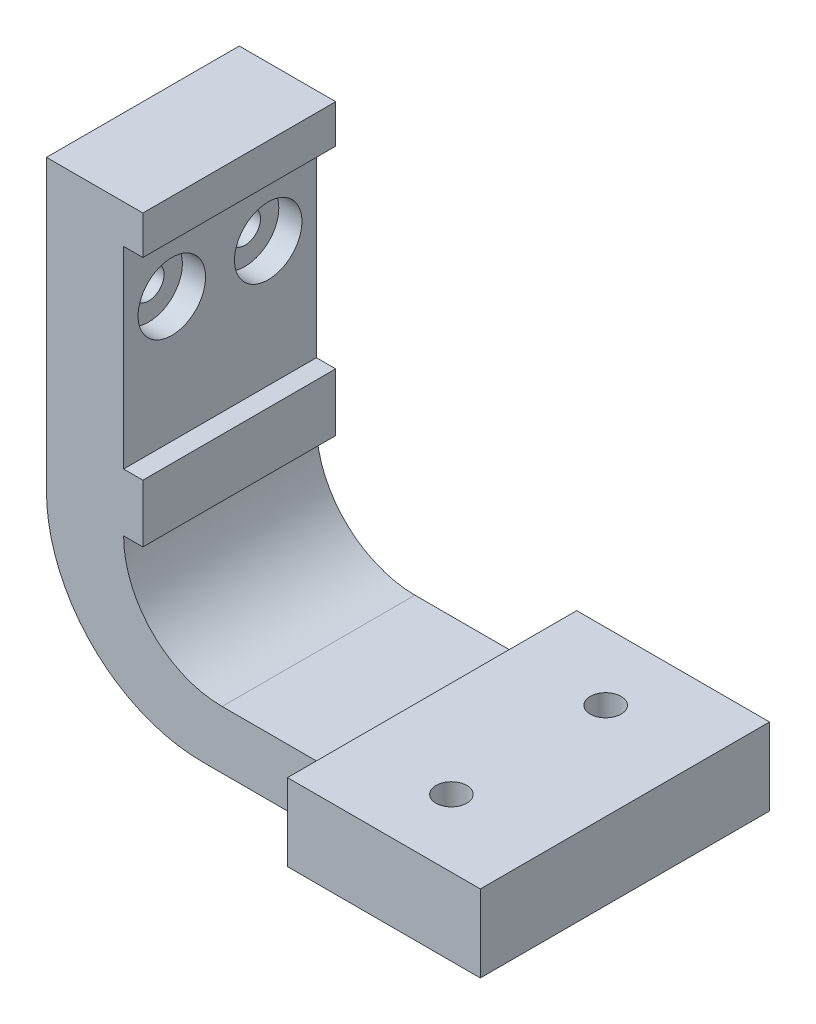
ISO-10303-21;
HEADER;
FILE_DESCRIPTION(('STEP AP214'),'2;1');
FILE_NAME('part.step','',(''),(''),'','','');
FILE_SCHEMA(('AUTOMOTIVE_DESIGN { 1 0 10303 214 1 1 1 1 }'));
ENDSEC;
DATA;
#1=APPLICATION_CONTEXT('core data for automotive mechanical design processes');
#2=APPLICATION_PROTOCOL_DEFINITION('international standard','automotive_design',2000,#1);
#3=PRODUCT_CONTEXT('',#1,'mechanical');
#4=PRODUCT('Part','Part','',(#3));
#5=PRODUCT_RELATED_PRODUCT_CATEGORY('part','',(#4));
#6=PRODUCT_DEFINITION_FORMATION('','',#4);
#7=PRODUCT_DEFINITION_CONTEXT('part definition',#1,'design');
#8=PRODUCT_DEFINITION('design','',#6,#7);
#9=PRODUCT_DEFINITION_SHAPE('','',#8);
#10=(LENGTH_UNIT() NAMED_UNIT(*) SI_UNIT(.MILLI.,.METRE.));
#11=(NAMED_UNIT(*) PLANE_ANGLE_UNIT() SI_UNIT($,.RADIAN.));
#12=(NAMED_UNIT(*) SI_UNIT($,.STERADIAN.) SOLID_ANGLE_UNIT());
#13=UNCERTAINTY_MEASURE_WITH_UNIT(LENGTH_MEASURE(1.E-05),#10,'distance_accuracy_value','');
#14=(GEOMETRIC_REPRESENTATION_CONTEXT(3) GLOBAL_UNCERTAINTY_ASSIGNED_CONTEXT((#13)) GLOBAL_UNIT_ASSIGNED_CONTEXT((#10,
#11,#12)) REPRESENTATION_CONTEXT('',''));
#15=CARTESIAN_POINT('',(0.,0.,0.));
#16=DIRECTION('',(0.,0.,1.));
#17=DIRECTION('',(1.,0.,0.));
#18=AXIS2_PLACEMENT_3D('',#15,#16,#17);
#19=CARTESIAN_POINT('',(-17.537374179852,9.5,-2.5));
#20=DIRECTION('',(1.,0.,0.));
#21=DIRECTION('',(0.,0.,-1.));
#22=AXIS2_PLACEMENT_3D('',#19,#20,#21);
#23=CYLINDRICAL_SURFACE('',#22,0.799999999999999);
#24=CARTESIAN_POINT('',(-21.537374179852,9.5,-2.5));
#25=DIRECTION('',(1.,0.,0.));
#26=DIRECTION('',(0.,0.,-1.));
#27=AXIS2_PLACEMENT_3D('',#24,#25,#26);
#28=CIRCLE('',#27,0.799999999999999);
#29=CARTESIAN_POINT('',(-21.537374179852,9.5,-3.3));
#30=VERTEX_POINT('',#29);
#31=EDGE_CURVE('E170',#30,#30,#28,.T.);
#32=ORIENTED_EDGE('',*,*,#31,.F.);
#33=EDGE_LOOP('',(#32));
#34=FACE_BOUND('',#33,.T.);
#35=CARTESIAN_POINT('',(-18.737374179852,9.5,-2.5));
#36=DIRECTION('',(1.,0.,0.));
#37=DIRECTION('',(0.,0.,-1.));
#38=AXIS2_PLACEMENT_3D('',#35,#36,#37);
#39=CIRCLE('',#38,0.799999999999999);
#40=CARTESIAN_POINT('',(-18.737374179852,9.5,-3.3));
#41=VERTEX_POINT('',#40);
#42=EDGE_CURVE('E242',#41,#41,#39,.F.);
#43=ORIENTED_EDGE('',*,*,#42,.F.);
#44=EDGE_LOOP('',(#43));
#45=FACE_BOUND('',#44,.T.);
#46=ADVANCED_FACE('F39',(#34,#45),#23,.F.);
#47=CARTESIAN_POINT('',(-17.537374179852,9.5,2.5));
#48=DIRECTION('',(1.,0.,0.));
#49=DIRECTION('',(0.,0.,-1.));
#50=AXIS2_PLACEMENT_3D('',#47,#48,#49);
#51=CYLINDRICAL_SURFACE('',#50,0.799999999999999);
#52=CARTESIAN_POINT('',(-21.537374179852,9.5,2.5));
#53=DIRECTION('',(1.,0.,0.));
#54=DIRECTION('',(0.,0.,-1.));
#55=AXIS2_PLACEMENT_3D('',#52,#53,#54);
#56=CIRCLE('',#55,0.799999999999999);
#57=CARTESIAN_POINT('',(-21.537374179852,9.5,1.7));
#58=VERTEX_POINT('',#57);
#59=EDGE_CURVE('E246',#58,#58,#56,.T.);
#60=ORIENTED_EDGE('',*,*,#59,.F.);
#61=EDGE_LOOP('',(#60));
#62=FACE_BOUND('',#61,.T.);
#63=CARTESIAN_POINT('',(-18.737374179852,9.5,2.5));
#64=DIRECTION('',(1.,0.,0.));
#65=DIRECTION('',(0.,0.,-1.));
#66=AXIS2_PLACEMENT_3D('',#63,#64,#65);
#67=CIRCLE('',#66,0.799999999999999);
#68=CARTESIAN_POINT('',(-18.737374179852,9.5,1.7));
#69=VERTEX_POINT('',#68);
#70=EDGE_CURVE('E239',#69,#69,#67,.F.);
#71=ORIENTED_EDGE('',*,*,#70,.F.);
#72=EDGE_LOOP('',(#71));
#73=FACE_BOUND('',#72,.T.);
#74=ADVANCED_FACE('F399',(#62,#73),#51,.F.);
#75=CARTESIAN_POINT('',(-16.5373741798521,3.,5.));
#76=DIRECTION('',(-1.,0.,0.));
#77=DIRECTION('',(0.,-1.,0.));
#78=AXIS2_PLACEMENT_3D('',#75,#76,#77);
#79=PLANE('',#78);
#80=DIRECTION('',(0.,1.,0.));
#81=VECTOR('',#80,1.);
#82=CARTESIAN_POINT('',(-16.5373741798521,3.,-5.));
#83=LINE('',#82,#81);
#84=CARTESIAN_POINT('',(-16.537374179852,0.,-5.));
#85=VERTEX_POINT('',#84);
#86=CARTESIAN_POINT('',(-16.5373741798521,3.,-5.));
#87=VERTEX_POINT('',#86);
#88=EDGE_CURVE('E165',#85,#87,#83,.T.);
#89=ORIENTED_EDGE('',*,*,#88,.T.);
#90=DIRECTION('',(0.,0.,-1.));
#91=VECTOR('',#90,1.);
#92=CARTESIAN_POINT('',(-16.5373741798521,3.,5.));
#93=LINE('',#92,#91);
#94=CARTESIAN_POINT('',(-16.5373741798521,3.,5.));
#95=VERTEX_POINT('',#94);
#96=EDGE_CURVE('E49',#95,#87,#93,.T.);
#97=ORIENTED_EDGE('',*,*,#96,.F.);
#98=DIRECTION('',(0.,1.,0.));
#99=VECTOR('',#98,1.);
#100=CARTESIAN_POINT('',(-16.5373741798521,3.,5.));
#101=LINE('',#100,#99);
#102=CARTESIAN_POINT('',(-16.537374179852,0.,5.));
#103=VERTEX_POINT('',#102);
#104=EDGE_CURVE('E201',#103,#95,#101,.T.);
#105=ORIENTED_EDGE('',*,*,#104,.F.);
#106=DIRECTION('',(0.,0.,-1.));
#107=VECTOR('',#106,1.);
#108=CARTESIAN_POINT('',(-16.537374179852,0.,5.));
#109=LINE('',#108,#107);
#110=EDGE_CURVE('E161',#103,#85,#109,.T.);
#111=ORIENTED_EDGE('',*,*,#110,.T.);
#112=EDGE_LOOP('',(#89,#97,#105,#111));
#113=FACE_BOUND('',#112,.T.);
#114=ADVANCED_FACE('F41',(#113),#79,.F.);
#115=CARTESIAN_POINT('',(-17.537374179852,3.,5.));
#116=DIRECTION('',(0.,-1.,0.));
#117=DIRECTION('',(0.,0.,-1.));
#118=AXIS2_PLACEMENT_3D('',#115,#116,#117);
#119=PLANE('',#118);
#120=DIRECTION('',(-1.,0.,0.));
#121=VECTOR('',#120,1.);
#122=CARTESIAN_POINT('',(-17.537374179852,3.,-5.));
#123=LINE('',#122,#121);
#124=CARTESIAN_POINT('',(-17.537374179852,3.,-5.));
#125=VERTEX_POINT('',#124);
#126=EDGE_CURVE('E169',#87,#125,#123,.T.);
#127=ORIENTED_EDGE('',*,*,#126,.T.);
#128=DIRECTION('',(0.,0.,-1.));
#129=VECTOR('',#128,1.);
#130=CARTESIAN_POINT('',(-17.537374179852,3.,5.));
#131=LINE('',#130,#129);
#132=CARTESIAN_POINT('',(-17.537374179852,3.,5.));
#133=VERTEX_POINT('',#132);
#134=EDGE_CURVE('E233',#133,#125,#131,.T.);
#135=ORIENTED_EDGE('',*,*,#134,.F.);
#136=DIRECTION('',(-1.,0.,0.));
#137=VECTOR('',#136,1.);
#138=CARTESIAN_POINT('',(-17.537374179852,3.,5.));
#139=LINE('',#138,#137);
#140=EDGE_CURVE('E111',#95,#133,#139,.T.);
#141=ORIENTED_EDGE('',*,*,#140,.F.);
#142=ORIENTED_EDGE('',*,*,#96,.T.);
#143=EDGE_LOOP('',(#127,#135,#141,#142));
#144=FACE_BOUND('',#143,.T.);
#145=ADVANCED_FACE('F359',(#144),#119,.F.);
#146=CARTESIAN_POINT('',(-17.537374179852,3.,5.));
#147=DIRECTION('',(-1.,0.,0.));
#148=DIRECTION('',(0.,0.,1.));
#149=AXIS2_PLACEMENT_3D('',#146,#147,#148);
#150=PLANE('',#149);
#151=CARTESIAN_POINT('',(-17.537374179852,9.5,2.5));
#152=DIRECTION('',(1.,0.,0.));
#153=DIRECTION('',(0.,0.,-1.));
#154=AXIS2_PLACEMENT_3D('',#151,#152,#153);
#155=CIRCLE('',#154,1.75);
#156=CARTESIAN_POINT('',(-17.537374179852,9.5,0.75));
#157=VERTEX_POINT('',#156);
#158=EDGE_CURVE('E341',#157,#157,#155,.T.);
#159=ORIENTED_EDGE('',*,*,#158,.F.);
#160=EDGE_LOOP('',(#159));
#161=FACE_BOUND('',#160,.T.);
#162=CARTESIAN_POINT('',(-17.537374179852,9.5,-2.5));
#163=DIRECTION('',(1.,0.,0.));
#164=DIRECTION('',(0.,0.,-1.));
#165=AXIS2_PLACEMENT_3D('',#162,#163,#164);
#166=CIRCLE('',#165,1.75);
#167=CARTESIAN_POINT('',(-17.537374179852,9.5,-4.25));
#168=VERTEX_POINT('',#167);
#169=EDGE_CURVE('E258',#168,#168,#166,.T.);
#170=ORIENTED_EDGE('',*,*,#169,.F.);
#171=EDGE_LOOP('',(#170));
#172=FACE_BOUND('',#171,.T.);
#173=DIRECTION('',(0.,1.,0.));
#174=VECTOR('',#173,1.);
#175=CARTESIAN_POINT('',(-17.537374179852,3.,-5.));
#176=LINE('',#175,#174);
#177=CARTESIAN_POINT('',(-17.537374179852,13.,-5.));
#178=VERTEX_POINT('',#177);
#179=EDGE_CURVE('E173',#125,#178,#176,.T.);
#180=ORIENTED_EDGE('',*,*,#179,.T.);
#181=DIRECTION('',(0.,0.,-1.));
#182=VECTOR('',#181,1.);
#183=CARTESIAN_POINT('',(-17.537374179852,13.,5.));
#184=LINE('',#183,#182);
#185=CARTESIAN_POINT('',(-17.537374179852,13.,5.));
#186=VERTEX_POINT('',#185);
#187=EDGE_CURVE('E229',#186,#178,#184,.T.);
#188=ORIENTED_EDGE('',*,*,#187,.F.);
#189=DIRECTION('',(0.,1.,0.));
#190=VECTOR('',#189,1.);
#191=CARTESIAN_POINT('',(-17.537374179852,3.,5.));
#192=LINE('',#191,#190);
#193=EDGE_CURVE('E265',#133,#186,#192,.T.);
#194=ORIENTED_EDGE('',*,*,#193,.F.);
#195=ORIENTED_EDGE('',*,*,#134,.T.);
#196=EDGE_LOOP('',(#180,#188,#194,#195));
#197=FACE_BOUND('',#196,.T.);
#198=ADVANCED_FACE('F355',(#161,#172,#197),#150,.F.);
#199=CARTESIAN_POINT('',(-17.537374179852,13.,5.));
#200=DIRECTION('',(0.,1.,0.));
#201=DIRECTION('',(0.,0.,1.));
#202=AXIS2_PLACEMENT_3D('',#199,#200,#201);
#203=PLANE('',#202);
#204=DIRECTION('',(1.,0.,0.));
#205=VECTOR('',#204,1.);
#206=CARTESIAN_POINT('',(-17.537374179852,13.,-5.));
#207=LINE('',#206,#205);
#208=CARTESIAN_POINT('',(-16.5373741798521,13.,-5.));
#209=VERTEX_POINT('',#208);
#210=EDGE_CURVE('E176',#178,#209,#207,.T.);
#211=ORIENTED_EDGE('',*,*,#210,.T.);
#212=DIRECTION('',(0.,0.,-1.));
#213=VECTOR('',#212,1.);
#214=CARTESIAN_POINT('',(-16.5373741798521,13.,5.));
#215=LINE('',#214,#213);
#216=CARTESIAN_POINT('',(-16.5373741798521,13.,5.));
#217=VERTEX_POINT('',#216);
#218=EDGE_CURVE('E225',#217,#209,#215,.T.);
#219=ORIENTED_EDGE('',*,*,#218,.F.);
#220=DIRECTION('',(1.,0.,0.));
#221=VECTOR('',#220,1.);
#222=CARTESIAN_POINT('',(-17.537374179852,13.,5.));
#223=LINE('',#222,#221);
#224=EDGE_CURVE('E268',#186,#217,#223,.T.);
#225=ORIENTED_EDGE('',*,*,#224,.F.);
#226=ORIENTED_EDGE('',*,*,#187,.T.);
#227=EDGE_LOOP('',(#211,#219,#225,#226));
#228=FACE_BOUND('',#227,.T.);
#229=ADVANCED_FACE('F358',(#228),#203,.F.);
#230=CARTESIAN_POINT('',(-16.537374179852,15.,5.));
#231=DIRECTION('',(-1.,0.,0.));
#232=DIRECTION('',(0.,-1.,0.));
#233=AXIS2_PLACEMENT_3D('',#230,#231,#232);
#234=PLANE('',#233);
#235=DIRECTION('',(0.,1.,0.));
#236=VECTOR('',#235,1.);
#237=CARTESIAN_POINT('',(-16.537374179852,15.,-5.));
#238=LINE('',#237,#236);
#239=CARTESIAN_POINT('',(-16.537374179852,15.,-5.));
#240=VERTEX_POINT('',#239);
#241=EDGE_CURVE('E179',#209,#240,#238,.T.);
#242=ORIENTED_EDGE('',*,*,#241,.T.);
#243=DIRECTION('',(0.,0.,-1.));
#244=VECTOR('',#243,1.);
#245=CARTESIAN_POINT('',(-16.537374179852,15.,5.));
#246=LINE('',#245,#244);
#247=CARTESIAN_POINT('',(-16.537374179852,15.,5.));
#248=VERTEX_POINT('',#247);
#249=EDGE_CURVE('E221',#248,#240,#246,.T.);
#250=ORIENTED_EDGE('',*,*,#249,.F.);
#251=DIRECTION('',(0.,1.,0.));
#252=VECTOR('',#251,1.);
#253=CARTESIAN_POINT('',(-16.537374179852,15.,5.));
#254=LINE('',#253,#252);
#255=EDGE_CURVE('E271',#217,#248,#254,.T.);
#256=ORIENTED_EDGE('',*,*,#255,.F.);
#257=ORIENTED_EDGE('',*,*,#218,.T.);
#258=EDGE_LOOP('',(#242,#250,#256,#257));
#259=FACE_BOUND('',#258,.T.);
#260=ADVANCED_FACE('F376',(#259),#234,.F.);
#261=CARTESIAN_POINT('',(-21.537374179852,15.,5.));
#262=DIRECTION('',(0.,-1.,0.));
#263=DIRECTION('',(0.,0.,-1.));
#264=AXIS2_PLACEMENT_3D('',#261,#262,#263);
#265=PLANE('',#264);
#266=DIRECTION('',(-1.,0.,0.));
#267=VECTOR('',#266,1.);
#268=CARTESIAN_POINT('',(-21.537374179852,15.,-5.));
#269=LINE('',#268,#267);
#270=CARTESIAN_POINT('',(-21.537374179852,15.,-5.));
#271=VERTEX_POINT('',#270);
#272=EDGE_CURVE('E182',#240,#271,#269,.T.);
#273=ORIENTED_EDGE('',*,*,#272,.T.);
#274=DIRECTION('',(0.,0.,-1.));
#275=VECTOR('',#274,1.);
#276=CARTESIAN_POINT('',(-21.537374179852,15.,5.));
#277=LINE('',#276,#275);
#278=CARTESIAN_POINT('',(-21.537374179852,15.,5.));
#279=VERTEX_POINT('',#278);
#280=EDGE_CURVE('E217',#279,#271,#277,.T.);
#281=ORIENTED_EDGE('',*,*,#280,.F.);
#282=DIRECTION('',(-1.,0.,0.));
#283=VECTOR('',#282,1.);
#284=CARTESIAN_POINT('',(-21.537374179852,15.,5.));
#285=LINE('',#284,#283);
#286=EDGE_CURVE('E274',#248,#279,#285,.T.);
#287=ORIENTED_EDGE('',*,*,#286,.F.);
#288=ORIENTED_EDGE('',*,*,#249,.T.);
#289=EDGE_LOOP('',(#273,#281,#287,#288));
#290=FACE_BOUND('',#289,.T.);
#291=ADVANCED_FACE('F380',(#290),#265,.F.);
#292=CARTESIAN_POINT('',(-21.537374179852,0.,5.));
#293=DIRECTION('',(1.,0.,0.));
#294=DIRECTION('',(0.,0.,-1.));
#295=AXIS2_PLACEMENT_3D('',#292,#293,#294);
#296=PLANE('',#295);
#297=ORIENTED_EDGE('',*,*,#59,.T.);
#298=EDGE_LOOP('',(#297));
#299=FACE_BOUND('',#298,.T.);
#300=ORIENTED_EDGE('',*,*,#31,.T.);
#301=EDGE_LOOP('',(#300));
#302=FACE_BOUND('',#301,.T.);
#303=DIRECTION('',(0.,-1.,0.));
#304=VECTOR('',#303,1.);
#305=CARTESIAN_POINT('',(-21.537374179852,0.,-5.));
#306=LINE('',#305,#304);
#307=CARTESIAN_POINT('',(-21.537374179852,0.,-5.));
#308=VERTEX_POINT('',#307);
#309=EDGE_CURVE('E185',#271,#308,#306,.T.);
#310=ORIENTED_EDGE('',*,*,#309,.T.);
#311=DIRECTION('',(0.,0.,-1.));
#312=VECTOR('',#311,1.);
#313=CARTESIAN_POINT('',(-21.537374179852,0.,5.));
#314=LINE('',#313,#312);
#315=CARTESIAN_POINT('',(-21.537374179852,0.,5.));
#316=VERTEX_POINT('',#315);
#317=EDGE_CURVE('E213',#316,#308,#314,.T.);
#318=ORIENTED_EDGE('',*,*,#317,.F.);
#319=DIRECTION('',(0.,-1.,0.));
#320=VECTOR('',#319,1.);
#321=CARTESIAN_POINT('',(-21.537374179852,0.,5.));
#322=LINE('',#321,#320);
#323=EDGE_CURVE('E277',#279,#316,#322,.T.);
#324=ORIENTED_EDGE('',*,*,#323,.F.);
#325=ORIENTED_EDGE('',*,*,#280,.T.);
#326=EDGE_LOOP('',(#310,#318,#324,#325));
#327=FACE_BOUND('',#326,.T.);
#328=ADVANCED_FACE('F504',(#299,#302,#327),#296,.F.);
#329=CARTESIAN_POINT('',(-13.427374179852,0.,5.));
#330=DIRECTION('',(0.,0.,-1.));
#331=DIRECTION('',(-1.,0.,0.));
#332=AXIS2_PLACEMENT_3D('',#329,#330,#331);
#333=CYLINDRICAL_SURFACE('',#332,8.11);
#334=CARTESIAN_POINT('',(-13.427374179852,0.,-5.));
#335=DIRECTION('',(0.,0.,1.));
#336=DIRECTION('',(1.,0.,0.));
#337=AXIS2_PLACEMENT_3D('',#334,#335,#336);
#338=CIRCLE('',#337,8.11);
#339=CARTESIAN_POINT('',(-13.427374179852,-8.11,-5.));
#340=VERTEX_POINT('',#339);
#341=EDGE_CURVE('E188',#308,#340,#338,.T.);
#342=ORIENTED_EDGE('',*,*,#341,.T.);
#343=DIRECTION('',(0.,0.,-1.));
#344=VECTOR('',#343,1.);
#345=CARTESIAN_POINT('',(-13.427374179852,-8.11,5.));
#346=LINE('',#345,#344);
#347=CARTESIAN_POINT('',(-13.427374179852,-8.11,5.));
#348=VERTEX_POINT('',#347);
#349=EDGE_CURVE('E209',#348,#340,#346,.T.);
#350=ORIENTED_EDGE('',*,*,#349,.F.);
#351=CARTESIAN_POINT('',(-13.427374179852,0.,5.));
#352=DIRECTION('',(0.,0.,1.));
#353=DIRECTION('',(1.,0.,0.));
#354=AXIS2_PLACEMENT_3D('',#351,#352,#353);
#355=CIRCLE('',#354,8.11);
#356=EDGE_CURVE('E280',#316,#348,#355,.T.);
#357=ORIENTED_EDGE('',*,*,#356,.F.);
#358=ORIENTED_EDGE('',*,*,#317,.T.);
#359=EDGE_LOOP('',(#342,#350,#357,#358));
#360=FACE_BOUND('',#359,.T.);
#361=ADVANCED_FACE('F502',(#360),#333,.T.);
#362=CARTESIAN_POINT('',(3.46262582014795,-8.11,5.));
#363=DIRECTION('',(0.,1.,0.));
#364=DIRECTION('',(-1.,0.,0.));
#365=AXIS2_PLACEMENT_3D('',#362,#363,#364);
#366=PLANE('',#365);
#367=CARTESIAN_POINT('',(-1.53737417985205,-8.11,4.));
#368=DIRECTION('',(0.,1.,0.));
#369=DIRECTION('',(0.,0.,1.));
#370=AXIS2_PLACEMENT_3D('',#367,#368,#369);
#371=CIRCLE('',#370,0.799999999999999);
#372=CARTESIAN_POINT('',(-1.53737417985205,-8.11,4.8));
#373=VERTEX_POINT('',#372);
#374=EDGE_CURVE('E460',#373,#373,#371,.T.);
#375=ORIENTED_EDGE('',*,*,#374,.T.);
#376=EDGE_LOOP('',(#375));
#377=FACE_BOUND('',#376,.T.);
#378=CARTESIAN_POINT('',(-1.53737417985205,-8.11,-4.));
#379=DIRECTION('',(0.,1.,0.));
#380=DIRECTION('',(0.,0.,1.));
#381=AXIS2_PLACEMENT_3D('',#378,#379,#380);
#382=CIRCLE('',#381,0.799999999999999);
#383=CARTESIAN_POINT('',(-1.53737417985205,-8.11,-3.2));
#384=VERTEX_POINT('',#383);
#385=EDGE_CURVE('E451',#384,#384,#382,.T.);
#386=ORIENTED_EDGE('',*,*,#385,.T.);
#387=EDGE_LOOP('',(#386));
#388=FACE_BOUND('',#387,.T.);
#389=DIRECTION('',(1.,0.,0.));
#390=VECTOR('',#389,1.);
#391=CARTESIAN_POINT('',(3.46262582014795,-8.11,-5.));
#392=LINE('',#391,#390);
#393=CARTESIAN_POINT('',(-6.53737417985205,-8.11,-5.));
#394=VERTEX_POINT('',#393);
#395=EDGE_CURVE('E191',#340,#394,#392,.T.);
#396=ORIENTED_EDGE('',*,*,#395,.T.);
#397=DIRECTION('',(0.,0.,-1.));
#398=VECTOR('',#397,1.);
#399=CARTESIAN_POINT('',(-6.53737417985205,-8.11,7.5));
#400=LINE('',#399,#398);
#401=CARTESIAN_POINT('',(-6.53737417985205,-8.11,-7.5));
#402=VERTEX_POINT('',#401);
#403=EDGE_CURVE('E305',#394,#402,#400,.T.);
#404=ORIENTED_EDGE('',*,*,#403,.T.);
#405=DIRECTION('',(1.,0.,0.));
#406=VECTOR('',#405,1.);
#407=CARTESIAN_POINT('',(-6.53737417985205,-8.11,-7.5));
#408=LINE('',#407,#406);
#409=CARTESIAN_POINT('',(3.46262582014795,-8.11,-7.5));
#410=VERTEX_POINT('',#409);
#411=EDGE_CURVE('E304',#402,#410,#408,.T.);
#412=ORIENTED_EDGE('',*,*,#411,.T.);
#413=DIRECTION('',(0.,0.,-1.));
#414=VECTOR('',#413,1.);
#415=CARTESIAN_POINT('',(3.46262582014795,-8.11,5.));
#416=LINE('',#415,#414);
#417=CARTESIAN_POINT('',(3.46262582014795,-8.11,7.5));
#418=VERTEX_POINT('',#417);
#419=EDGE_CURVE('E154',#418,#410,#416,.T.);
#420=ORIENTED_EDGE('',*,*,#419,.F.);
#421=DIRECTION('',(-1.,0.,0.));
#422=VECTOR('',#421,1.);
#423=CARTESIAN_POINT('',(3.46262582014795,-8.11,7.5));
#424=LINE('',#423,#422);
#425=CARTESIAN_POINT('',(-6.53737417985205,-8.11,7.5));
#426=VERTEX_POINT('',#425);
#427=EDGE_CURVE('E300',#418,#426,#424,.T.);
#428=ORIENTED_EDGE('',*,*,#427,.T.);
#429=CARTESIAN_POINT('',(-6.53737417985205,-8.11,5.));
#430=VERTEX_POINT('',#429);
#431=EDGE_CURVE('E296',#426,#430,#400,.T.);
#432=ORIENTED_EDGE('',*,*,#431,.T.);
#433=DIRECTION('',(1.,0.,0.));
#434=VECTOR('',#433,1.);
#435=CARTESIAN_POINT('',(3.46262582014795,-8.11,5.));
#436=LINE('',#435,#434);
#437=EDGE_CURVE('E147',#348,#430,#436,.T.);
#438=ORIENTED_EDGE('',*,*,#437,.F.);
#439=ORIENTED_EDGE('',*,*,#349,.T.);
#440=EDGE_LOOP('',(#396,#404,#412,#420,#428,#432,#438,#439));
#441=FACE_BOUND('',#440,.T.);
#442=ADVANCED_FACE('F292',(#377,#388,#441),#366,.F.);
#443=CARTESIAN_POINT('',(3.46262582014795,-5.11,5.));
#444=DIRECTION('',(-1.,0.,0.));
#445=DIRECTION('',(0.,0.,1.));
#446=AXIS2_PLACEMENT_3D('',#443,#444,#445);
#447=PLANE('',#446);
#448=ORIENTED_EDGE('',*,*,#419,.T.);
#449=DIRECTION('',(0.,-1.,0.));
#450=VECTOR('',#449,1.);
#451=CARTESIAN_POINT('',(3.46262582014795,-4.11,-7.5));
#452=LINE('',#451,#450);
#453=CARTESIAN_POINT('',(3.46262582014795,-4.11,-7.5));
#454=VERTEX_POINT('',#453);
#455=EDGE_CURVE('E321',#454,#410,#452,.T.);
#456=ORIENTED_EDGE('',*,*,#455,.F.);
#457=DIRECTION('',(0.,0.,1.));
#458=VECTOR('',#457,1.);
#459=CARTESIAN_POINT('',(3.46262582014795,-4.11,-7.5));
#460=LINE('',#459,#458);
#461=CARTESIAN_POINT('',(3.46262582014795,-4.11,7.5));
#462=VERTEX_POINT('',#461);
#463=EDGE_CURVE('E333',#454,#462,#460,.T.);
#464=ORIENTED_EDGE('',*,*,#463,.T.);
#465=DIRECTION('',(0.,-1.,0.));
#466=VECTOR('',#465,1.);
#467=CARTESIAN_POINT('',(3.46262582014795,-4.11,7.5));
#468=LINE('',#467,#466);
#469=EDGE_CURVE('E316',#462,#418,#468,.T.);
#470=ORIENTED_EDGE('',*,*,#469,.T.);
#471=EDGE_LOOP('',(#448,#456,#464,#470));
#472=FACE_BOUND('',#471,.T.);
#473=ADVANCED_FACE('F478',(#472),#447,.F.);
#474=CARTESIAN_POINT('',(-12.427374179852,-5.11,5.));
#475=DIRECTION('',(0.,-1.,0.));
#476=DIRECTION('',(1.,0.,0.));
#477=AXIS2_PLACEMENT_3D('',#474,#475,#476);
#478=PLANE('',#477);
#479=DIRECTION('',(-1.,0.,0.));
#480=VECTOR('',#479,1.);
#481=CARTESIAN_POINT('',(-12.427374179852,-5.11,5.));
#482=LINE('',#481,#480);
#483=CARTESIAN_POINT('',(-6.53737417985205,-5.11,5.));
#484=VERTEX_POINT('',#483);
#485=CARTESIAN_POINT('',(-12.4273741798521,-5.11,5.));
#486=VERTEX_POINT('',#485);
#487=EDGE_CURVE('E136',#484,#486,#482,.T.);
#488=ORIENTED_EDGE('',*,*,#487,.F.);
#489=DIRECTION('',(0.,0.,-1.));
#490=VECTOR('',#489,1.);
#491=CARTESIAN_POINT('',(-6.53737417985205,-5.11,5.));
#492=LINE('',#491,#490);
#493=CARTESIAN_POINT('',(-6.53737417985205,-5.11,-5.));
#494=VERTEX_POINT('',#493);
#495=EDGE_CURVE('E320',#484,#494,#492,.T.);
#496=ORIENTED_EDGE('',*,*,#495,.T.);
#497=DIRECTION('',(-1.,0.,0.));
#498=VECTOR('',#497,1.);
#499=CARTESIAN_POINT('',(-12.427374179852,-5.11,-5.));
#500=LINE('',#499,#498);
#501=CARTESIAN_POINT('',(-12.4273741798521,-5.11,-5.));
#502=VERTEX_POINT('',#501);
#503=EDGE_CURVE('E152',#494,#502,#500,.T.);
#504=ORIENTED_EDGE('',*,*,#503,.T.);
#505=DIRECTION('',(0.,0.,-1.));
#506=VECTOR('',#505,1.);
#507=CARTESIAN_POINT('',(-12.4273741798521,-5.11,5.));
#508=LINE('',#507,#506);
#509=EDGE_CURVE('E149',#486,#502,#508,.T.);
#510=ORIENTED_EDGE('',*,*,#509,.F.);
#511=EDGE_LOOP('',(#488,#496,#504,#510));
#512=FACE_BOUND('',#511,.T.);
#513=ADVANCED_FACE('F150',(#512),#478,.F.);
#514=CARTESIAN_POINT('',(-12.427374179852,0.,5.));
#515=DIRECTION('',(0.,0.,-1.));
#516=DIRECTION('',(-1.,0.,0.));
#517=AXIS2_PLACEMENT_3D('',#514,#515,#516);
#518=CYLINDRICAL_SURFACE('',#517,5.11);
#519=CARTESIAN_POINT('',(-12.427374179852,0.,-5.));
#520=DIRECTION('',(0.,0.,-1.));
#521=DIRECTION('',(1.,0.,0.));
#522=AXIS2_PLACEMENT_3D('',#519,#520,#521);
#523=CIRCLE('',#522,5.11);
#524=CARTESIAN_POINT('',(-17.537374179852,0.,-5.));
#525=VERTEX_POINT('',#524);
#526=EDGE_CURVE('E96',#502,#525,#523,.T.);
#527=ORIENTED_EDGE('',*,*,#526,.T.);
#528=DIRECTION('',(0.,0.,-1.));
#529=VECTOR('',#528,1.);
#530=CARTESIAN_POINT('',(-17.537374179852,0.,5.));
#531=LINE('',#530,#529);
#532=CARTESIAN_POINT('',(-17.537374179852,0.,5.));
#533=VERTEX_POINT('',#532);
#534=EDGE_CURVE('E155',#533,#525,#531,.T.);
#535=ORIENTED_EDGE('',*,*,#534,.F.);
#536=CARTESIAN_POINT('',(-12.427374179852,0.,5.));
#537=DIRECTION('',(0.,0.,-1.));
#538=DIRECTION('',(1.,0.,0.));
#539=AXIS2_PLACEMENT_3D('',#536,#537,#538);
#540=CIRCLE('',#539,5.11);
#541=EDGE_CURVE('E140',#486,#533,#540,.T.);
#542=ORIENTED_EDGE('',*,*,#541,.F.);
#543=ORIENTED_EDGE('',*,*,#509,.T.);
#544=EDGE_LOOP('',(#527,#535,#542,#543));
#545=FACE_BOUND('',#544,.T.);
#546=ADVANCED_FACE('F157',(#545),#518,.F.);
#547=CARTESIAN_POINT('',(-16.537374179852,0.,5.));
#548=DIRECTION('',(0.,1.,0.));
#549=DIRECTION('',(-1.,0.,0.));
#550=AXIS2_PLACEMENT_3D('',#547,#548,#549);
#551=PLANE('',#550);
#552=DIRECTION('',(1.,0.,0.));
#553=VECTOR('',#552,1.);
#554=CARTESIAN_POINT('',(-16.537374179852,0.,-5.));
#555=LINE('',#554,#553);
#556=EDGE_CURVE('E102',#525,#85,#555,.T.);
#557=ORIENTED_EDGE('',*,*,#556,.T.);
#558=ORIENTED_EDGE('',*,*,#110,.F.);
#559=DIRECTION('',(1.,0.,0.));
#560=VECTOR('',#559,1.);
#561=CARTESIAN_POINT('',(-16.537374179852,0.,5.));
#562=LINE('',#561,#560);
#563=EDGE_CURVE('E57',#533,#103,#562,.T.);
#564=ORIENTED_EDGE('',*,*,#563,.F.);
#565=ORIENTED_EDGE('',*,*,#534,.T.);
#566=EDGE_LOOP('',(#557,#558,#564,#565));
#567=FACE_BOUND('',#566,.T.);
#568=ADVANCED_FACE('F388',(#567),#551,.F.);
#569=CARTESIAN_POINT('',(-12.427374179852,0.,5.));
#570=DIRECTION('',(0.,0.,1.));
#571=DIRECTION('',(1.,0.,0.));
#572=AXIS2_PLACEMENT_3D('',#569,#570,#571);
#573=PLANE('',#572);
#574=DIRECTION('',(0.,-1.,0.));
#575=VECTOR('',#574,1.);
#576=CARTESIAN_POINT('',(-6.53737417985205,0.,5.));
#577=LINE('',#576,#575);
#578=EDGE_CURVE('E143',#484,#430,#577,.T.);
#579=ORIENTED_EDGE('',*,*,#578,.F.);
#580=ORIENTED_EDGE('',*,*,#487,.T.);
#581=ORIENTED_EDGE('',*,*,#541,.T.);
#582=ORIENTED_EDGE('',*,*,#563,.T.);
#583=ORIENTED_EDGE('',*,*,#104,.T.);
#584=ORIENTED_EDGE('',*,*,#140,.T.);
#585=ORIENTED_EDGE('',*,*,#193,.T.);
#586=ORIENTED_EDGE('',*,*,#224,.T.);
#587=ORIENTED_EDGE('',*,*,#255,.T.);
#588=ORIENTED_EDGE('',*,*,#286,.T.);
#589=ORIENTED_EDGE('',*,*,#323,.T.);
#590=ORIENTED_EDGE('',*,*,#356,.T.);
#591=ORIENTED_EDGE('',*,*,#437,.T.);
#592=EDGE_LOOP('',(#579,#580,#581,#582,#583,#584,#585,#586,#587,#588,#589,#590,#591));
#593=FACE_BOUND('',#592,.T.);
#594=ADVANCED_FACE('F138',(#593),#573,.T.);
#595=CARTESIAN_POINT('',(-12.427374179852,0.,-5.));
#596=DIRECTION('',(0.,0.,1.));
#597=DIRECTION('',(1.,0.,0.));
#598=AXIS2_PLACEMENT_3D('',#595,#596,#597);
#599=PLANE('',#598);
#600=ORIENTED_EDGE('',*,*,#503,.F.);
#601=DIRECTION('',(0.,-1.,0.));
#602=VECTOR('',#601,1.);
#603=CARTESIAN_POINT('',(-6.53737417985205,0.,-5.));
#604=LINE('',#603,#602);
#605=EDGE_CURVE('E11',#494,#394,#604,.T.);
#606=ORIENTED_EDGE('',*,*,#605,.T.);
#607=ORIENTED_EDGE('',*,*,#395,.F.);
#608=ORIENTED_EDGE('',*,*,#341,.F.);
#609=ORIENTED_EDGE('',*,*,#309,.F.);
#610=ORIENTED_EDGE('',*,*,#272,.F.);
#611=ORIENTED_EDGE('',*,*,#241,.F.);
#612=ORIENTED_EDGE('',*,*,#210,.F.);
#613=ORIENTED_EDGE('',*,*,#179,.F.);
#614=ORIENTED_EDGE('',*,*,#126,.F.);
#615=ORIENTED_EDGE('',*,*,#88,.F.);
#616=ORIENTED_EDGE('',*,*,#556,.F.);
#617=ORIENTED_EDGE('',*,*,#526,.F.);
#618=EDGE_LOOP('',(#600,#606,#607,#608,#609,#610,#611,#612,#613,#614,#615,#616,#617));
#619=FACE_BOUND('',#618,.T.);
#620=ADVANCED_FACE('F371',(#619),#599,.F.);
#621=CARTESIAN_POINT('',(-18.737374179852,9.5,2.5));
#622=DIRECTION('',(1.,0.,0.));
#623=DIRECTION('',(0.,0.,-1.));
#624=AXIS2_PLACEMENT_3D('',#621,#622,#623);
#625=PLANE('',#624);
#626=CARTESIAN_POINT('',(-18.737374179852,9.5,2.5));
#627=DIRECTION('',(1.,0.,0.));
#628=DIRECTION('',(0.,0.,-1.));
#629=AXIS2_PLACEMENT_3D('',#626,#627,#628);
#630=CIRCLE('',#629,1.75);
#631=CARTESIAN_POINT('',(-18.737374179852,9.5,0.75));
#632=VERTEX_POINT('',#631);
#633=EDGE_CURVE('E243',#632,#632,#630,.T.);
#634=ORIENTED_EDGE('',*,*,#633,.T.);
#635=EDGE_LOOP('',(#634));
#636=FACE_BOUND('',#635,.T.);
#637=ORIENTED_EDGE('',*,*,#70,.T.);
#638=EDGE_LOOP('',(#637));
#639=FACE_BOUND('',#638,.T.);
#640=ADVANCED_FACE('F411',(#636,#639),#625,.T.);
#641=CARTESIAN_POINT('',(-18.737374179852,9.5,2.5));
#642=DIRECTION('',(1.,0.,0.));
#643=DIRECTION('',(0.,0.,-1.));
#644=AXIS2_PLACEMENT_3D('',#641,#642,#643);
#645=CYLINDRICAL_SURFACE('',#644,1.75);
#646=ORIENTED_EDGE('',*,*,#633,.F.);
#647=EDGE_LOOP('',(#646));
#648=FACE_BOUND('',#647,.T.);
#649=ORIENTED_EDGE('',*,*,#158,.T.);
#650=EDGE_LOOP('',(#649));
#651=FACE_BOUND('',#650,.T.);
#652=ADVANCED_FACE('F415',(#648,#651),#645,.F.);
#653=CARTESIAN_POINT('',(-18.737374179852,9.5,-2.5));
#654=DIRECTION('',(1.,0.,0.));
#655=DIRECTION('',(0.,0.,-1.));
#656=AXIS2_PLACEMENT_3D('',#653,#654,#655);
#657=PLANE('',#656);
#658=CARTESIAN_POINT('',(-18.737374179852,9.5,-2.5));
#659=DIRECTION('',(1.,0.,0.));
#660=DIRECTION('',(0.,0.,-1.));
#661=AXIS2_PLACEMENT_3D('',#658,#659,#660);
#662=CIRCLE('',#661,1.75);
#663=CARTESIAN_POINT('',(-18.737374179852,9.5,-4.25));
#664=VERTEX_POINT('',#663);
#665=EDGE_CURVE('E344',#664,#664,#662,.T.);
#666=ORIENTED_EDGE('',*,*,#665,.T.);
#667=EDGE_LOOP('',(#666));
#668=FACE_BOUND('',#667,.T.);
#669=ORIENTED_EDGE('',*,*,#42,.T.);
#670=EDGE_LOOP('',(#669));
#671=FACE_BOUND('',#670,.T.);
#672=ADVANCED_FACE('F421',(#668,#671),#657,.T.);
#673=CARTESIAN_POINT('',(-18.737374179852,9.5,-2.5));
#674=DIRECTION('',(1.,0.,0.));
#675=DIRECTION('',(0.,0.,-1.));
#676=AXIS2_PLACEMENT_3D('',#673,#674,#675);
#677=CYLINDRICAL_SURFACE('',#676,1.75);
#678=ORIENTED_EDGE('',*,*,#665,.F.);
#679=EDGE_LOOP('',(#678));
#680=FACE_BOUND('',#679,.T.);
#681=ORIENTED_EDGE('',*,*,#169,.T.);
#682=EDGE_LOOP('',(#681));
#683=FACE_BOUND('',#682,.T.);
#684=ADVANCED_FACE('F353',(#680,#683),#677,.F.);
#685=CARTESIAN_POINT('',(3.46262582014795,-4.11,7.5));
#686=DIRECTION('',(0.,0.,1.));
#687=DIRECTION('',(1.,0.,0.));
#688=AXIS2_PLACEMENT_3D('',#685,#686,#687);
#689=PLANE('',#688);
#690=ORIENTED_EDGE('',*,*,#427,.F.);
#691=ORIENTED_EDGE('',*,*,#469,.F.);
#692=DIRECTION('',(-1.,0.,0.));
#693=VECTOR('',#692,1.);
#694=CARTESIAN_POINT('',(3.46262582014795,-4.11,7.5));
#695=LINE('',#694,#693);
#696=CARTESIAN_POINT('',(-6.53737417985205,-4.11,7.5));
#697=VERTEX_POINT('',#696);
#698=EDGE_CURVE('E310',#462,#697,#695,.T.);
#699=ORIENTED_EDGE('',*,*,#698,.T.);
#700=DIRECTION('',(0.,-1.,0.));
#701=VECTOR('',#700,1.);
#702=CARTESIAN_POINT('',(-6.53737417985205,-4.11,7.5));
#703=LINE('',#702,#701);
#704=EDGE_CURVE('E329',#697,#426,#703,.T.);
#705=ORIENTED_EDGE('',*,*,#704,.T.);
#706=EDGE_LOOP('',(#690,#691,#699,#705));
#707=FACE_BOUND('',#706,.T.);
#708=ADVANCED_FACE('F426',(#707),#689,.T.);
#709=CARTESIAN_POINT('',(-6.53737417985205,-4.11,-7.5));
#710=DIRECTION('',(0.,0.,-1.));
#711=DIRECTION('',(-1.,0.,0.));
#712=AXIS2_PLACEMENT_3D('',#709,#710,#711);
#713=PLANE('',#712);
#714=ORIENTED_EDGE('',*,*,#411,.F.);
#715=DIRECTION('',(0.,-1.,0.));
#716=VECTOR('',#715,1.);
#717=CARTESIAN_POINT('',(-6.53737417985205,-4.11,-7.5));
#718=LINE('',#717,#716);
#719=CARTESIAN_POINT('',(-6.53737417985205,-4.11,-7.5));
#720=VERTEX_POINT('',#719);
#721=EDGE_CURVE('E325',#720,#402,#718,.T.);
#722=ORIENTED_EDGE('',*,*,#721,.F.);
#723=DIRECTION('',(1.,0.,0.));
#724=VECTOR('',#723,1.);
#725=CARTESIAN_POINT('',(-6.53737417985205,-4.11,-7.5));
#726=LINE('',#725,#724);
#727=EDGE_CURVE('E470',#720,#454,#726,.T.);
#728=ORIENTED_EDGE('',*,*,#727,.T.);
#729=ORIENTED_EDGE('',*,*,#455,.T.);
#730=EDGE_LOOP('',(#714,#722,#728,#729));
#731=FACE_BOUND('',#730,.T.);
#732=ADVANCED_FACE('F435',(#731),#713,.T.);
#733=CARTESIAN_POINT('',(-6.53737417985205,-4.11,7.5));
#734=DIRECTION('',(-1.,0.,0.));
#735=DIRECTION('',(0.,-1.,0.));
#736=AXIS2_PLACEMENT_3D('',#733,#734,#735);
#737=PLANE('',#736);
#738=ORIENTED_EDGE('',*,*,#495,.F.);
#739=ORIENTED_EDGE('',*,*,#578,.T.);
#740=ORIENTED_EDGE('',*,*,#431,.F.);
#741=ORIENTED_EDGE('',*,*,#704,.F.);
#742=DIRECTION('',(0.,0.,-1.));
#743=VECTOR('',#742,1.);
#744=CARTESIAN_POINT('',(-6.53737417985205,-4.11,7.5));
#745=LINE('',#744,#743);
#746=EDGE_CURVE('E466',#697,#720,#745,.T.);
#747=ORIENTED_EDGE('',*,*,#746,.T.);
#748=ORIENTED_EDGE('',*,*,#721,.T.);
#749=ORIENTED_EDGE('',*,*,#403,.F.);
#750=ORIENTED_EDGE('',*,*,#605,.F.);
#751=EDGE_LOOP('',(#738,#739,#740,#741,#747,#748,#749,#750));
#752=FACE_BOUND('',#751,.T.);
#753=ADVANCED_FACE('F440',(#752),#737,.T.);
#754=CARTESIAN_POINT('',(0.,-4.11,0.));
#755=DIRECTION('',(0.,-1.,0.));
#756=DIRECTION('',(0.,0.,-1.));
#757=AXIS2_PLACEMENT_3D('',#754,#755,#756);
#758=PLANE('',#757);
#759=CARTESIAN_POINT('',(-1.53737417985205,-4.11,4.));
#760=DIRECTION('',(0.,1.,0.));
#761=DIRECTION('',(0.,0.,1.));
#762=AXIS2_PLACEMENT_3D('',#759,#760,#761);
#763=CIRCLE('',#762,0.799999999999988);
#764=CARTESIAN_POINT('',(-1.53737417985205,-4.11,4.79999999999999));
#765=VERTEX_POINT('',#764);
#766=EDGE_CURVE('E652',#765,#765,#763,.T.);
#767=ORIENTED_EDGE('',*,*,#766,.F.);
#768=EDGE_LOOP('',(#767));
#769=FACE_BOUND('',#768,.T.);
#770=CARTESIAN_POINT('',(-1.53737417985205,-4.11,-4.));
#771=DIRECTION('',(0.,1.,0.));
#772=DIRECTION('',(0.,0.,1.));
#773=AXIS2_PLACEMENT_3D('',#770,#771,#772);
#774=CIRCLE('',#773,0.799999999999988);
#775=CARTESIAN_POINT('',(-1.53737417985205,-4.11,-3.20000000000001));
#776=VERTEX_POINT('',#775);
#777=EDGE_CURVE('E454',#776,#776,#774,.T.);
#778=ORIENTED_EDGE('',*,*,#777,.F.);
#779=EDGE_LOOP('',(#778));
#780=FACE_BOUND('',#779,.T.);
#781=ORIENTED_EDGE('',*,*,#698,.F.);
#782=ORIENTED_EDGE('',*,*,#463,.F.);
#783=ORIENTED_EDGE('',*,*,#727,.F.);
#784=ORIENTED_EDGE('',*,*,#746,.F.);
#785=EDGE_LOOP('',(#781,#782,#783,#784));
#786=FACE_BOUND('',#785,.T.);
#787=ADVANCED_FACE('F483',(#769,#780,#786),#758,.F.);
#788=CARTESIAN_POINT('',(-1.53737417985205,-4.11,-4.));
#789=DIRECTION('',(0.,1.,0.));
#790=DIRECTION('',(0.,0.,1.));
#791=AXIS2_PLACEMENT_3D('',#788,#789,#790);
#792=CYLINDRICAL_SURFACE('',#791,0.799999999999994);
#793=ORIENTED_EDGE('',*,*,#385,.F.);
#794=EDGE_LOOP('',(#793));
#795=FACE_BOUND('',#794,.T.);
#796=ORIENTED_EDGE('',*,*,#777,.T.);
#797=EDGE_LOOP('',(#796));
#798=FACE_BOUND('',#797,.T.);
#799=ADVANCED_FACE('F623',(#795,#798),#792,.F.);
#800=CARTESIAN_POINT('',(-1.53737417985205,-4.11,4.));
#801=DIRECTION('',(0.,1.,0.));
#802=DIRECTION('',(0.,0.,1.));
#803=AXIS2_PLACEMENT_3D('',#800,#801,#802);
#804=CYLINDRICAL_SURFACE('',#803,0.799999999999994);
#805=ORIENTED_EDGE('',*,*,#374,.F.);
#806=EDGE_LOOP('',(#805));
#807=FACE_BOUND('',#806,.T.);
#808=ORIENTED_EDGE('',*,*,#766,.T.);
#809=EDGE_LOOP('',(#808));
#810=FACE_BOUND('',#809,.T.);
#811=ADVANCED_FACE('F633',(#807,#810),#804,.F.);
#812=CLOSED_SHELL('',(#46,#74,#114,#145,#198,#229,#260,#291,#328,#361,#442,#473,#513,#546,#568,
#594,#620,#640,#652,#672,#684,#708,#732,#753,#787,#799,#811));
#813=MANIFOLD_SOLID_BREP('B2',#812);
#814=ADVANCED_BREP_SHAPE_REPRESENTATION('',(#18,#813),#14);
#815=SHAPE_DEFINITION_REPRESENTATION(#9,#814);
ENDSEC;
END-ISO-10303-21;
